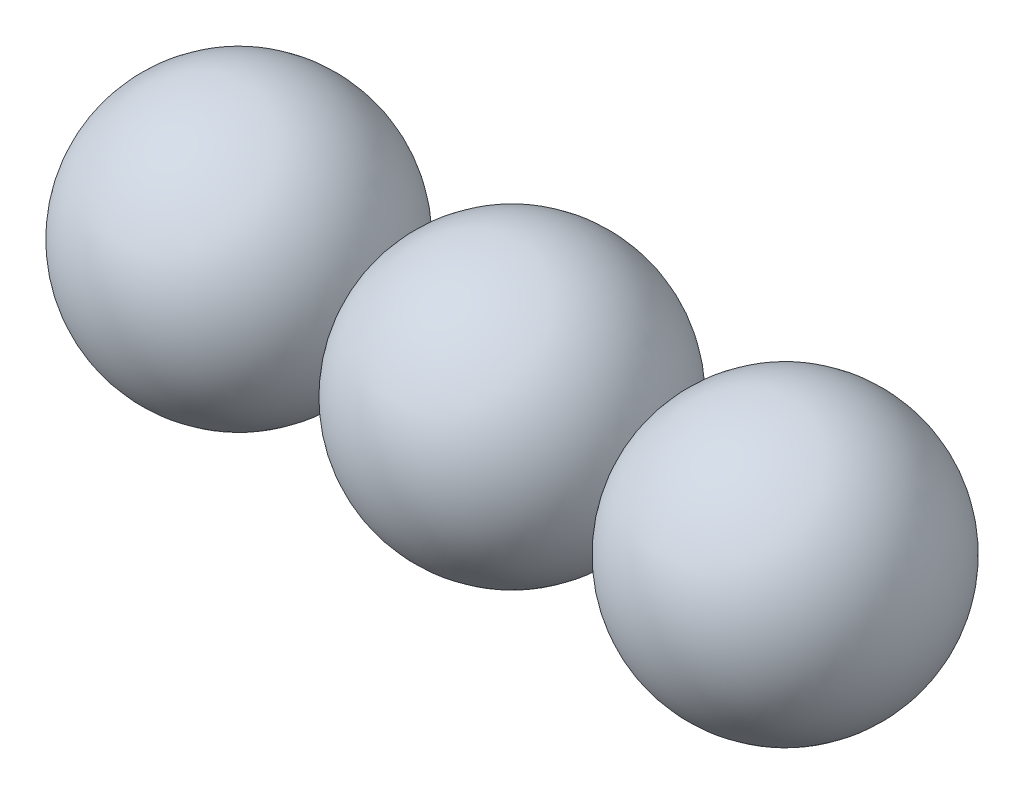
ISO-10303-21;
HEADER;
FILE_DESCRIPTION(('STEP AP214'),'2;1');
FILE_NAME('part.step','',(''),(''),'','','');
FILE_SCHEMA(('AUTOMOTIVE_DESIGN { 1 0 10303 214 1 1 1 1 }'));
ENDSEC;
DATA;
#1=APPLICATION_CONTEXT('core data for automotive mechanical design processes');
#2=APPLICATION_PROTOCOL_DEFINITION('international standard','automotive_design',2000,#1);
#3=PRODUCT_CONTEXT('',#1,'mechanical');
#4=PRODUCT('Part','Part','',(#3));
#5=PRODUCT_RELATED_PRODUCT_CATEGORY('part','',(#4));
#6=PRODUCT_DEFINITION_FORMATION('','',#4);
#7=PRODUCT_DEFINITION_CONTEXT('part definition',#1,'design');
#8=PRODUCT_DEFINITION('design','',#6,#7);
#9=PRODUCT_DEFINITION_SHAPE('','',#8);
#10=(LENGTH_UNIT() NAMED_UNIT(*) SI_UNIT(.MILLI.,.METRE.));
#11=(NAMED_UNIT(*) PLANE_ANGLE_UNIT() SI_UNIT($,.RADIAN.));
#12=(NAMED_UNIT(*) SI_UNIT($,.STERADIAN.) SOLID_ANGLE_UNIT());
#13=UNCERTAINTY_MEASURE_WITH_UNIT(LENGTH_MEASURE(1.E-05),#10,'distance_accuracy_value','');
#14=(GEOMETRIC_REPRESENTATION_CONTEXT(3) GLOBAL_UNCERTAINTY_ASSIGNED_CONTEXT((#13)) GLOBAL_UNIT_ASSIGNED_CONTEXT((#10,
#11,#12)) REPRESENTATION_CONTEXT('',''));
#15=CARTESIAN_POINT('',(0.,0.,0.));
#16=DIRECTION('',(0.,0.,1.));
#17=DIRECTION('',(1.,0.,0.));
#18=AXIS2_PLACEMENT_3D('',#15,#16,#17);
#19=CARTESIAN_POINT('',(120.,0.,0.));
#20=DIRECTION('',(0.,1.,0.));
#21=DIRECTION('',(1.,0.,0.));
#22=AXIS2_PLACEMENT_3D('',#19,#20,#21);
#23=SPHERICAL_SURFACE('',#22,30.);
#24=CARTESIAN_POINT('',(120.,30.,0.));
#25=VERTEX_POINT('',#24);
#26=VERTEX_LOOP('',#25);
#27=FACE_BOUND('',#26,.T.);
#28=ADVANCED_FACE('F40',(#27),#23,.T.);
#29=CLOSED_SHELL('',(#28));
#30=MANIFOLD_SOLID_BREP('B2',#29);
#31=CARTESIAN_POINT('',(60.,0.,0.));
#32=DIRECTION('',(0.,1.,0.));
#33=DIRECTION('',(1.,0.,0.));
#34=AXIS2_PLACEMENT_3D('',#31,#32,#33);
#35=SPHERICAL_SURFACE('',#34,30.);
#36=CARTESIAN_POINT('',(90.,0.,0.));
#37=VERTEX_POINT('',#36);
#38=VERTEX_LOOP('',#37);
#39=FACE_BOUND('',#38,.T.);
#40=ADVANCED_FACE('F60',(#39),#35,.T.);
#41=CLOSED_SHELL('',(#40));
#42=MANIFOLD_SOLID_BREP('B6',#41);
#43=CARTESIAN_POINT('',(0.,0.,0.));
#44=DIRECTION('',(0.,1.,0.));
#45=DIRECTION('',(1.,0.,0.));
#46=AXIS2_PLACEMENT_3D('',#43,#44,#45);
#47=SPHERICAL_SURFACE('',#46,30.);
#48=CARTESIAN_POINT('',(30.,0.,0.));
#49=VERTEX_POINT('',#48);
#50=VERTEX_LOOP('',#49);
#51=FACE_BOUND('',#50,.T.);
#52=ADVANCED_FACE('F73',(#51),#47,.T.);
#53=CLOSED_SHELL('',(#52));
#54=MANIFOLD_SOLID_BREP('B34',#53);
#55=ADVANCED_BREP_SHAPE_REPRESENTATION('',(#18,#30,#42,#54),#14);
#56=SHAPE_DEFINITION_REPRESENTATION(#9,#55);
ENDSEC;
END-ISO-10303-21;
